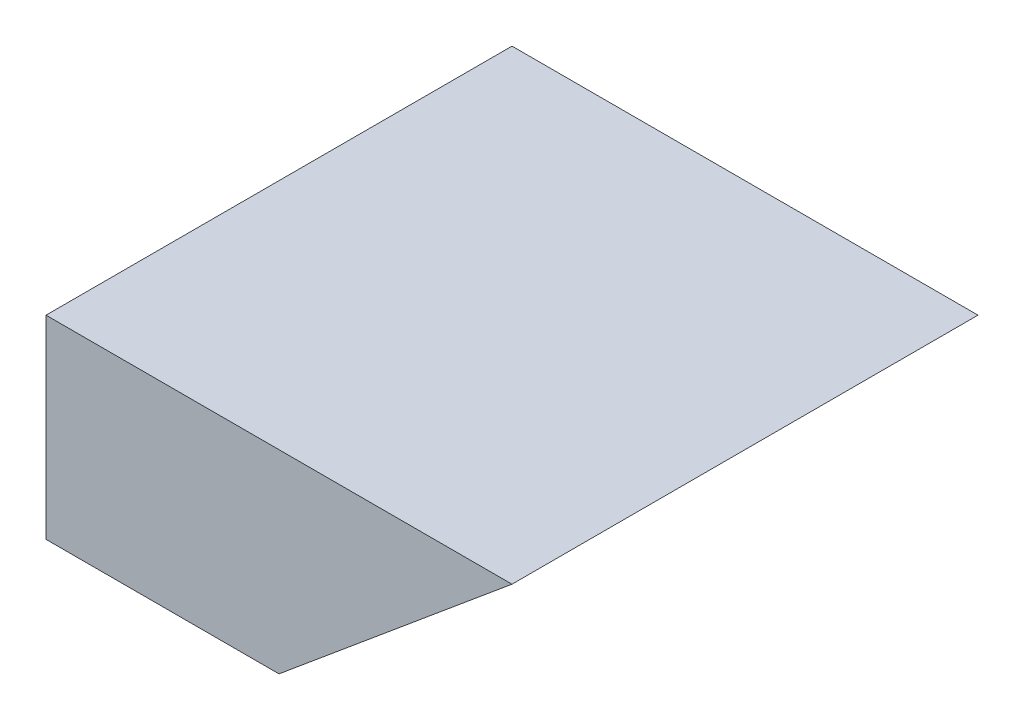
ISO-10303-21;
HEADER;
FILE_DESCRIPTION(('STEP AP214'),'2;1');
FILE_NAME('part.step','',(''),(''),'','','');
FILE_SCHEMA(('AUTOMOTIVE_DESIGN { 1 0 10303 214 1 1 1 1 }'));
ENDSEC;
DATA;
#1=APPLICATION_CONTEXT('core data for automotive mechanical design processes');
#2=APPLICATION_PROTOCOL_DEFINITION('international standard','automotive_design',2000,#1);
#3=PRODUCT_CONTEXT('',#1,'mechanical');
#4=PRODUCT('Part','Part','',(#3));
#5=PRODUCT_RELATED_PRODUCT_CATEGORY('part','',(#4));
#6=PRODUCT_DEFINITION_FORMATION('','',#4);
#7=PRODUCT_DEFINITION_CONTEXT('part definition',#1,'design');
#8=PRODUCT_DEFINITION('design','',#6,#7);
#9=PRODUCT_DEFINITION_SHAPE('','',#8);
#10=(LENGTH_UNIT() NAMED_UNIT(*) SI_UNIT(.MILLI.,.METRE.));
#11=(NAMED_UNIT(*) PLANE_ANGLE_UNIT() SI_UNIT($,.RADIAN.));
#12=(NAMED_UNIT(*) SI_UNIT($,.STERADIAN.) SOLID_ANGLE_UNIT());
#13=UNCERTAINTY_MEASURE_WITH_UNIT(LENGTH_MEASURE(1.E-05),#10,'distance_accuracy_value','');
#14=(GEOMETRIC_REPRESENTATION_CONTEXT(3) GLOBAL_UNCERTAINTY_ASSIGNED_CONTEXT((#13)) GLOBAL_UNIT_ASSIGNED_CONTEXT((#10,
#11,#12)) REPRESENTATION_CONTEXT('',''));
#15=CARTESIAN_POINT('',(0.,0.,0.));
#16=DIRECTION('',(0.,0.,1.));
#17=DIRECTION('',(1.,0.,0.));
#18=AXIS2_PLACEMENT_3D('',#15,#16,#17);
#19=CARTESIAN_POINT('',(-60.,50.,-60.));
#20=DIRECTION('',(0.,0.,1.));
#21=DIRECTION('',(1.,0.,0.));
#22=AXIS2_PLACEMENT_3D('',#19,#20,#21);
#23=PLANE('',#22);
#24=DIRECTION('',(-1.,0.,0.));
#25=VECTOR('',#24,1.);
#26=CARTESIAN_POINT('',(-60.,50.,-60.));
#27=LINE('',#26,#25);
#28=CARTESIAN_POINT('',(60.,50.,-60.));
#29=VERTEX_POINT('',#28);
#30=CARTESIAN_POINT('',(-60.,50.,-60.));
#31=VERTEX_POINT('',#30);
#32=EDGE_CURVE('E89',#29,#31,#27,.T.);
#33=ORIENTED_EDGE('',*,*,#32,.F.);
#34=DIRECTION('',(-0.768221279597376,-0.64018439966448,0.));
#35=VECTOR('',#34,1.);
#36=CARTESIAN_POINT('',(0.,0.,-60.));
#37=LINE('',#36,#35);
#38=CARTESIAN_POINT('',(0.,0.,-60.));
#39=VERTEX_POINT('',#38);
#40=EDGE_CURVE('E97',#29,#39,#37,.T.);
#41=ORIENTED_EDGE('',*,*,#40,.T.);
#42=DIRECTION('',(-1.,0.,0.));
#43=VECTOR('',#42,1.);
#44=CARTESIAN_POINT('',(-60.,0.,-60.));
#45=LINE('',#44,#43);
#46=CARTESIAN_POINT('',(-60.,0.,-60.));
#47=VERTEX_POINT('',#46);
#48=EDGE_CURVE('E78',#39,#47,#45,.T.);
#49=ORIENTED_EDGE('',*,*,#48,.T.);
#50=DIRECTION('',(0.,-1.,0.));
#51=VECTOR('',#50,1.);
#52=CARTESIAN_POINT('',(-60.,50.,-60.));
#53=LINE('',#52,#51);
#54=EDGE_CURVE('E11',#31,#47,#53,.T.);
#55=ORIENTED_EDGE('',*,*,#54,.F.);
#56=EDGE_LOOP('',(#33,#41,#49,#55));
#57=FACE_BOUND('',#56,.T.);
#58=ADVANCED_FACE('F34',(#57),#23,.F.);
#59=CARTESIAN_POINT('',(-60.,50.,-60.));
#60=DIRECTION('',(1.,0.,0.));
#61=DIRECTION('',(0.,0.,-1.));
#62=AXIS2_PLACEMENT_3D('',#59,#60,#61);
#63=PLANE('',#62);
#64=DIRECTION('',(0.,0.,1.));
#65=VECTOR('',#64,1.);
#66=CARTESIAN_POINT('',(-60.,0.,-60.));
#67=LINE('',#66,#65);
#68=CARTESIAN_POINT('',(-60.,0.,60.));
#69=VERTEX_POINT('',#68);
#70=EDGE_CURVE('E69',#47,#69,#67,.T.);
#71=ORIENTED_EDGE('',*,*,#70,.T.);
#72=DIRECTION('',(0.,-1.,0.));
#73=VECTOR('',#72,1.);
#74=CARTESIAN_POINT('',(-60.,50.,60.));
#75=LINE('',#74,#73);
#76=CARTESIAN_POINT('',(-60.,50.,60.));
#77=VERTEX_POINT('',#76);
#78=EDGE_CURVE('E41',#77,#69,#75,.T.);
#79=ORIENTED_EDGE('',*,*,#78,.F.);
#80=DIRECTION('',(0.,0.,1.));
#81=VECTOR('',#80,1.);
#82=CARTESIAN_POINT('',(-60.,50.,-60.));
#83=LINE('',#82,#81);
#84=EDGE_CURVE('E57',#31,#77,#83,.T.);
#85=ORIENTED_EDGE('',*,*,#84,.F.);
#86=ORIENTED_EDGE('',*,*,#54,.T.);
#87=EDGE_LOOP('',(#71,#79,#85,#86));
#88=FACE_BOUND('',#87,.T.);
#89=ADVANCED_FACE('F71',(#88),#63,.F.);
#90=CARTESIAN_POINT('',(-60.,50.,60.));
#91=DIRECTION('',(0.,0.,-1.));
#92=DIRECTION('',(-1.,0.,0.));
#93=AXIS2_PLACEMENT_3D('',#90,#91,#92);
#94=PLANE('',#93);
#95=DIRECTION('',(1.,0.,0.));
#96=VECTOR('',#95,1.);
#97=CARTESIAN_POINT('',(-60.,0.,60.));
#98=LINE('',#97,#96);
#99=CARTESIAN_POINT('',(0.,0.,60.));
#100=VERTEX_POINT('',#99);
#101=EDGE_CURVE('E77',#69,#100,#98,.T.);
#102=ORIENTED_EDGE('',*,*,#101,.T.);
#103=DIRECTION('',(-0.768221279597376,-0.64018439966448,0.));
#104=VECTOR('',#103,1.);
#105=CARTESIAN_POINT('',(0.,0.,60.));
#106=LINE('',#105,#104);
#107=CARTESIAN_POINT('',(60.,50.,60.));
#108=VERTEX_POINT('',#107);
#109=EDGE_CURVE('E48',#108,#100,#106,.T.);
#110=ORIENTED_EDGE('',*,*,#109,.F.);
#111=DIRECTION('',(1.,0.,0.));
#112=VECTOR('',#111,1.);
#113=CARTESIAN_POINT('',(-60.,50.,60.));
#114=LINE('',#113,#112);
#115=EDGE_CURVE('E83',#77,#108,#114,.T.);
#116=ORIENTED_EDGE('',*,*,#115,.F.);
#117=ORIENTED_EDGE('',*,*,#78,.T.);
#118=EDGE_LOOP('',(#102,#110,#116,#117));
#119=FACE_BOUND('',#118,.T.);
#120=ADVANCED_FACE('F82',(#119),#94,.F.);
#121=CARTESIAN_POINT('',(0.,50.,0.));
#122=DIRECTION('',(0.,1.,0.));
#123=DIRECTION('',(0.,0.,1.));
#124=AXIS2_PLACEMENT_3D('',#121,#122,#123);
#125=PLANE('',#124);
#126=DIRECTION('',(0.,0.,-1.));
#127=VECTOR('',#126,1.);
#128=CARTESIAN_POINT('',(60.,50.,-60.));
#129=LINE('',#128,#127);
#130=EDGE_CURVE('E86',#108,#29,#129,.T.);
#131=ORIENTED_EDGE('',*,*,#130,.T.);
#132=ORIENTED_EDGE('',*,*,#32,.T.);
#133=ORIENTED_EDGE('',*,*,#84,.T.);
#134=ORIENTED_EDGE('',*,*,#115,.T.);
#135=EDGE_LOOP('',(#131,#132,#133,#134));
#136=FACE_BOUND('',#135,.T.);
#137=ADVANCED_FACE('F108',(#136),#125,.T.);
#138=CARTESIAN_POINT('',(0.,0.,0.));
#139=DIRECTION('',(0.,1.,0.));
#140=DIRECTION('',(0.,0.,1.));
#141=AXIS2_PLACEMENT_3D('',#138,#139,#140);
#142=PLANE('',#141);
#143=ORIENTED_EDGE('',*,*,#48,.F.);
#144=DIRECTION('',(0.,0.,1.));
#145=VECTOR('',#144,1.);
#146=CARTESIAN_POINT('',(0.,0.,-60.));
#147=LINE('',#146,#145);
#148=EDGE_CURVE('E85',#39,#100,#147,.T.);
#149=ORIENTED_EDGE('',*,*,#148,.T.);
#150=ORIENTED_EDGE('',*,*,#101,.F.);
#151=ORIENTED_EDGE('',*,*,#70,.F.);
#152=EDGE_LOOP('',(#143,#149,#150,#151));
#153=FACE_BOUND('',#152,.T.);
#154=ADVANCED_FACE('F84',(#153),#142,.F.);
#155=CARTESIAN_POINT('',(0.,0.,-60.));
#156=DIRECTION('',(-0.64018439966448,0.768221279597376,0.));
#157=DIRECTION('',(-0.768221279597376,-0.64018439966448,0.));
#158=AXIS2_PLACEMENT_3D('',#155,#156,#157);
#159=PLANE('',#158);
#160=ORIENTED_EDGE('',*,*,#109,.T.);
#161=ORIENTED_EDGE('',*,*,#148,.F.);
#162=ORIENTED_EDGE('',*,*,#40,.F.);
#163=ORIENTED_EDGE('',*,*,#130,.F.);
#164=EDGE_LOOP('',(#160,#161,#162,#163));
#165=FACE_BOUND('',#164,.T.);
#166=ADVANCED_FACE('F105',(#165),#159,.F.);
#167=CLOSED_SHELL('',(#58,#89,#120,#137,#154,#166));
#168=MANIFOLD_SOLID_BREP('B2',#167);
#169=ADVANCED_BREP_SHAPE_REPRESENTATION('',(#18,#168),#14);
#170=SHAPE_DEFINITION_REPRESENTATION(#9,#169);
ENDSEC;
END-ISO-10303-21;
